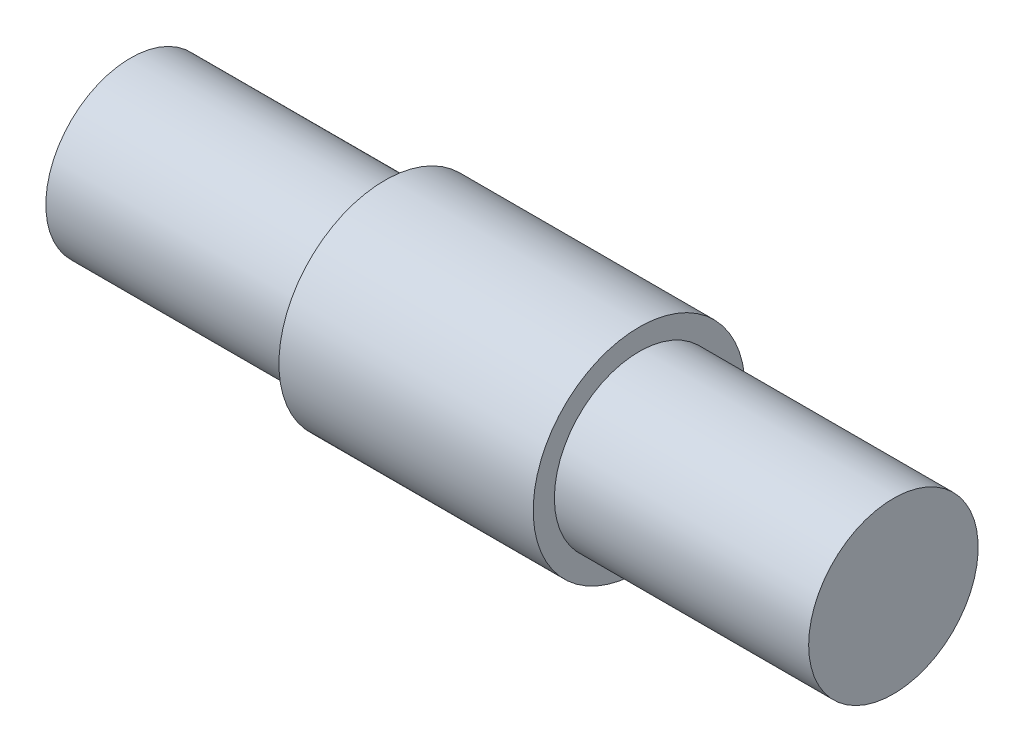
ISO-10303-21;
HEADER;
FILE_DESCRIPTION(('STEP AP214'),'2;1');
FILE_NAME('part.step','',(''),(''),'','','');
FILE_SCHEMA(('AUTOMOTIVE_DESIGN { 1 0 10303 214 1 1 1 1 }'));
ENDSEC;
DATA;
#1=APPLICATION_CONTEXT('core data for automotive mechanical design processes');
#2=APPLICATION_PROTOCOL_DEFINITION('international standard','automotive_design',2000,#1);
#3=PRODUCT_CONTEXT('',#1,'mechanical');
#4=PRODUCT('Part','Part','',(#3));
#5=PRODUCT_RELATED_PRODUCT_CATEGORY('part','',(#4));
#6=PRODUCT_DEFINITION_FORMATION('','',#4);
#7=PRODUCT_DEFINITION_CONTEXT('part definition',#1,'design');
#8=PRODUCT_DEFINITION('design','',#6,#7);
#9=PRODUCT_DEFINITION_SHAPE('','',#8);
#10=(LENGTH_UNIT() NAMED_UNIT(*) SI_UNIT(.MILLI.,.METRE.));
#11=(NAMED_UNIT(*) PLANE_ANGLE_UNIT() SI_UNIT($,.RADIAN.));
#12=(NAMED_UNIT(*) SI_UNIT($,.STERADIAN.) SOLID_ANGLE_UNIT());
#13=UNCERTAINTY_MEASURE_WITH_UNIT(LENGTH_MEASURE(1.E-05),#10,'distance_accuracy_value','');
#14=(GEOMETRIC_REPRESENTATION_CONTEXT(3) GLOBAL_UNCERTAINTY_ASSIGNED_CONTEXT((#13)) GLOBAL_UNIT_ASSIGNED_CONTEXT((#10,
#11,#12)) REPRESENTATION_CONTEXT('',''));
#15=CARTESIAN_POINT('',(0.,0.,0.));
#16=DIRECTION('',(0.,0.,1.));
#17=DIRECTION('',(1.,0.,0.));
#18=AXIS2_PLACEMENT_3D('',#15,#16,#17);
#19=CARTESIAN_POINT('',(4.7625,0.,0.));
#20=DIRECTION('',(-1.,0.,0.));
#21=DIRECTION('',(0.,0.,1.));
#22=AXIS2_PLACEMENT_3D('',#19,#20,#21);
#23=CYLINDRICAL_SURFACE('',#22,3.175);
#24=CARTESIAN_POINT('',(4.7625,0.,0.));
#25=DIRECTION('',(1.,0.,0.));
#26=DIRECTION('',(0.,0.,-1.));
#27=AXIS2_PLACEMENT_3D('',#24,#25,#26);
#28=CIRCLE('',#27,3.175);
#29=CARTESIAN_POINT('',(4.7625,0.,3.175));
#30=VERTEX_POINT('',#29);
#31=EDGE_CURVE('E45',#30,#30,#28,.T.);
#32=CARTESIAN_POINT('',(-4.7625,0.,0.));
#33=DIRECTION('',(1.,0.,0.));
#34=DIRECTION('',(0.,0.,-1.));
#35=AXIS2_PLACEMENT_3D('',#32,#33,#34);
#36=CIRCLE('',#35,3.175);
#37=CARTESIAN_POINT('',(-4.7625,0.,3.175));
#38=VERTEX_POINT('',#37);
#39=EDGE_CURVE('E40',#38,#38,#36,.T.);
#40=CARTESIAN_POINT('',(4.7625,0.,3.175));
#41=CARTESIAN_POINT('',(4.66328125,0.,3.175));
#42=CARTESIAN_POINT('',(4.5640625,0.,3.175));
#43=CARTESIAN_POINT('',(4.365625,0.,3.175));
#44=CARTESIAN_POINT('',(4.26640625,0.,3.175));
#45=CARTESIAN_POINT('',(4.06796875,0.,3.175));
#46=CARTESIAN_POINT('',(3.96875,0.,3.175));
#47=CARTESIAN_POINT('',(3.7703125,0.,3.175));
#48=CARTESIAN_POINT('',(3.67109375,0.,3.175));
#49=CARTESIAN_POINT('',(3.47265625,0.,3.175));
#50=CARTESIAN_POINT('',(3.3734375,0.,3.175));
#51=CARTESIAN_POINT('',(3.175,0.,3.175));
#52=CARTESIAN_POINT('',(3.07578125,0.,3.175));
#53=CARTESIAN_POINT('',(2.87734375,0.,3.175));
#54=CARTESIAN_POINT('',(2.778125,0.,3.175));
#55=CARTESIAN_POINT('',(2.5796875,0.,3.175));
#56=CARTESIAN_POINT('',(2.48046875,0.,3.175));
#57=CARTESIAN_POINT('',(2.28203125,0.,3.175));
#58=CARTESIAN_POINT('',(2.1828125,0.,3.175));
#59=CARTESIAN_POINT('',(1.984375,0.,3.175));
#60=CARTESIAN_POINT('',(1.88515625,0.,3.175));
#61=CARTESIAN_POINT('',(1.68671875,0.,3.175));
#62=CARTESIAN_POINT('',(1.5875,0.,3.175));
#63=CARTESIAN_POINT('',(1.3890625,0.,3.175));
#64=CARTESIAN_POINT('',(1.28984375,0.,3.175));
#65=CARTESIAN_POINT('',(1.09140625,0.,3.175));
#66=CARTESIAN_POINT('',(0.992187499999999,0.,3.175));
#67=CARTESIAN_POINT('',(0.79375,0.,3.175));
#68=CARTESIAN_POINT('',(0.69453125,0.,3.175));
#69=CARTESIAN_POINT('',(0.49609375,0.,3.175));
#70=CARTESIAN_POINT('',(0.396875,0.,3.175));
#71=CARTESIAN_POINT('',(0.1984375,0.,3.175));
#72=CARTESIAN_POINT('',(0.0992187500000001,0.,3.175));
#73=CARTESIAN_POINT('',(-0.0992187500000001,0.,3.175));
#74=CARTESIAN_POINT('',(-0.1984375,0.,3.175));
#75=CARTESIAN_POINT('',(-0.396875,0.,3.175));
#76=CARTESIAN_POINT('',(-0.49609375,0.,3.175));
#77=CARTESIAN_POINT('',(-0.69453125,0.,3.175));
#78=CARTESIAN_POINT('',(-0.793750000000001,0.,3.175));
#79=CARTESIAN_POINT('',(-0.992187500000001,0.,3.175));
#80=CARTESIAN_POINT('',(-1.09140625,0.,3.175));
#81=CARTESIAN_POINT('',(-1.28984375,0.,3.175));
#82=CARTESIAN_POINT('',(-1.3890625,0.,3.175));
#83=CARTESIAN_POINT('',(-1.5875,0.,3.175));
#84=CARTESIAN_POINT('',(-1.68671875,0.,3.175));
#85=CARTESIAN_POINT('',(-1.88515625,0.,3.175));
#86=CARTESIAN_POINT('',(-1.984375,0.,3.175));
#87=CARTESIAN_POINT('',(-2.1828125,0.,3.175));
#88=CARTESIAN_POINT('',(-2.28203125,0.,3.175));
#89=CARTESIAN_POINT('',(-2.48046875,0.,3.175));
#90=CARTESIAN_POINT('',(-2.5796875,0.,3.175));
#91=CARTESIAN_POINT('',(-2.778125,0.,3.175));
#92=CARTESIAN_POINT('',(-2.87734375,0.,3.175));
#93=CARTESIAN_POINT('',(-3.07578125,0.,3.175));
#94=CARTESIAN_POINT('',(-3.175,0.,3.175));
#95=CARTESIAN_POINT('',(-3.3734375,0.,3.175));
#96=CARTESIAN_POINT('',(-3.47265625,0.,3.175));
#97=CARTESIAN_POINT('',(-3.67109375,0.,3.175));
#98=CARTESIAN_POINT('',(-3.7703125,0.,3.175));
#99=CARTESIAN_POINT('',(-3.96875,0.,3.175));
#100=CARTESIAN_POINT('',(-4.06796875,0.,3.175));
#101=CARTESIAN_POINT('',(-4.26640625,0.,3.175));
#102=CARTESIAN_POINT('',(-4.365625,0.,3.175));
#103=CARTESIAN_POINT('',(-4.5640625,0.,3.175));
#104=CARTESIAN_POINT('',(-4.66328125,0.,3.175));
#105=CARTESIAN_POINT('',(-4.7625,0.,3.175));
#106=B_SPLINE_CURVE_WITH_KNOTS('',3,(#40,#41,#42,#43,#44,#45,#46,#47,#48,#49,#50,#51,#52,#53,
#54,#55,#56,#57,#58,#59,#60,#61,#62,#63,#64,#65,#66,#67,#68,#69,#70,#71,#72,#73,#74,#75,#76,#77,
#78,#79,#80,#81,#82,#83,#84,#85,#86,#87,#88,#89,#90,#91,#92,#93,#94,#95,#96,#97,#98,#99,#100,
#101,#102,#103,#104,#105),.UNSPECIFIED.,.F.,.F.,(4,2,2,2,2,2,2,2,2,2,2,2,2,2,2,2,2,2,2,2,2,2,2,
2,2,2,2,2,2,2,2,2,4),(0.,0.29765625,0.5953125,0.892968750000001,1.190625,1.48828125,1.7859375,
2.08359375,2.38125,2.67890625,2.9765625,3.27421875,3.571875,3.86953125,4.1671875,4.46484375,
4.7625,5.06015625,5.3578125,5.65546875,5.953125,6.25078125,6.5484375,6.84609375,7.14375,
7.44140625,7.7390625,8.03671875,8.334375,8.63203125,8.9296875,9.22734375,9.525),.UNSPECIFIED.);
#107=EDGE_CURVE('BSEAM37',#30,#38,#106,.T.);
#108=ORIENTED_EDGE('',*,*,#31,.F.);
#109=ORIENTED_EDGE('',*,*,#39,.T.);
#110=ORIENTED_EDGE('',*,*,#107,.T.);
#111=ORIENTED_EDGE('',*,*,#107,.F.);
#112=EDGE_LOOP('',(#108,#110,#109,#111));
#113=FACE_BOUND('',#112,.T.);
#114=ADVANCED_FACE('F37',(#113),#23,.T.);
#115=CARTESIAN_POINT('',(4.7625,0.,0.));
#116=DIRECTION('',(1.,0.,0.));
#117=DIRECTION('',(0.,0.,-1.));
#118=AXIS2_PLACEMENT_3D('',#115,#116,#117);
#119=PLANE('',#118);
#120=ORIENTED_EDGE('',*,*,#31,.T.);
#121=EDGE_LOOP('',(#120));
#122=FACE_BOUND('',#121,.T.);
#123=ADVANCED_FACE('F83',(#122),#119,.T.);
#124=CARTESIAN_POINT('',(-14.2875,0.,0.));
#125=DIRECTION('',(1.,0.,0.));
#126=DIRECTION('',(0.,0.,-1.));
#127=AXIS2_PLACEMENT_3D('',#124,#125,#126);
#128=CYLINDRICAL_SURFACE('',#127,3.96875);
#129=CARTESIAN_POINT('',(-14.2875,0.,0.));
#130=DIRECTION('',(-1.,0.,0.));
#131=DIRECTION('',(0.,0.,1.));
#132=AXIS2_PLACEMENT_3D('',#129,#130,#131);
#133=CIRCLE('',#132,3.96875);
#134=CARTESIAN_POINT('',(-14.2875,0.,-3.96875));
#135=VERTEX_POINT('',#134);
#136=EDGE_CURVE('E54',#135,#135,#133,.T.);
#137=CARTESIAN_POINT('',(-4.7625,0.,0.));
#138=DIRECTION('',(-1.,0.,0.));
#139=DIRECTION('',(0.,0.,1.));
#140=AXIS2_PLACEMENT_3D('',#137,#138,#139);
#141=CIRCLE('',#140,3.96875);
#142=CARTESIAN_POINT('',(-4.7625,0.,-3.96875));
#143=VERTEX_POINT('',#142);
#144=EDGE_CURVE('E58',#143,#143,#141,.T.);
#145=CARTESIAN_POINT('',(-14.2875,0.,-3.96875));
#146=CARTESIAN_POINT('',(-14.18828125,0.,-3.96875));
#147=CARTESIAN_POINT('',(-14.0890625,0.,-3.96875));
#148=CARTESIAN_POINT('',(-13.890625,0.,-3.96875));
#149=CARTESIAN_POINT('',(-13.79140625,0.,-3.96875));
#150=CARTESIAN_POINT('',(-13.59296875,0.,-3.96875));
#151=CARTESIAN_POINT('',(-13.49375,0.,-3.96875));
#152=CARTESIAN_POINT('',(-13.2953125,0.,-3.96875));
#153=CARTESIAN_POINT('',(-13.19609375,0.,-3.96875));
#154=CARTESIAN_POINT('',(-12.99765625,0.,-3.96875));
#155=CARTESIAN_POINT('',(-12.8984375,0.,-3.96875));
#156=CARTESIAN_POINT('',(-12.7,0.,-3.96875));
#157=CARTESIAN_POINT('',(-12.60078125,0.,-3.96875));
#158=CARTESIAN_POINT('',(-12.40234375,0.,-3.96875));
#159=CARTESIAN_POINT('',(-12.303125,0.,-3.96875));
#160=CARTESIAN_POINT('',(-12.1046875,0.,-3.96875));
#161=CARTESIAN_POINT('',(-12.00546875,0.,-3.96875));
#162=CARTESIAN_POINT('',(-11.80703125,0.,-3.96875));
#163=CARTESIAN_POINT('',(-11.7078125,0.,-3.96875));
#164=CARTESIAN_POINT('',(-11.509375,0.,-3.96875));
#165=CARTESIAN_POINT('',(-11.41015625,0.,-3.96875));
#166=CARTESIAN_POINT('',(-11.21171875,0.,-3.96875));
#167=CARTESIAN_POINT('',(-11.1125,0.,-3.96875));
#168=CARTESIAN_POINT('',(-10.9140625,0.,-3.96875));
#169=CARTESIAN_POINT('',(-10.81484375,0.,-3.96875));
#170=CARTESIAN_POINT('',(-10.61640625,0.,-3.96875));
#171=CARTESIAN_POINT('',(-10.5171875,0.,-3.96875));
#172=CARTESIAN_POINT('',(-10.31875,0.,-3.96875));
#173=CARTESIAN_POINT('',(-10.21953125,0.,-3.96875));
#174=CARTESIAN_POINT('',(-10.02109375,0.,-3.96875));
#175=CARTESIAN_POINT('',(-9.921875,0.,-3.96875));
#176=CARTESIAN_POINT('',(-9.7234375,0.,-3.96875));
#177=CARTESIAN_POINT('',(-9.62421875,0.,-3.96875));
#178=CARTESIAN_POINT('',(-9.42578125,0.,-3.96875));
#179=CARTESIAN_POINT('',(-9.3265625,0.,-3.96875));
#180=CARTESIAN_POINT('',(-9.128125,0.,-3.96875));
#181=CARTESIAN_POINT('',(-9.02890625,0.,-3.96875));
#182=CARTESIAN_POINT('',(-8.83046875,0.,-3.96875));
#183=CARTESIAN_POINT('',(-8.73125,0.,-3.96875));
#184=CARTESIAN_POINT('',(-8.5328125,0.,-3.96875));
#185=CARTESIAN_POINT('',(-8.43359375,0.,-3.96875));
#186=CARTESIAN_POINT('',(-8.23515625,0.,-3.96875));
#187=CARTESIAN_POINT('',(-8.1359375,0.,-3.96875));
#188=CARTESIAN_POINT('',(-7.9375,0.,-3.96875));
#189=CARTESIAN_POINT('',(-7.83828125,0.,-3.96875));
#190=CARTESIAN_POINT('',(-7.63984375,0.,-3.96875));
#191=CARTESIAN_POINT('',(-7.540625,0.,-3.96875));
#192=CARTESIAN_POINT('',(-7.3421875,0.,-3.96875));
#193=CARTESIAN_POINT('',(-7.24296875,0.,-3.96875));
#194=CARTESIAN_POINT('',(-7.04453125,0.,-3.96875));
#195=CARTESIAN_POINT('',(-6.9453125,0.,-3.96875));
#196=CARTESIAN_POINT('',(-6.746875,0.,-3.96875));
#197=CARTESIAN_POINT('',(-6.64765625,0.,-3.96875));
#198=CARTESIAN_POINT('',(-6.44921875,0.,-3.96875));
#199=CARTESIAN_POINT('',(-6.35,0.,-3.96875));
#200=CARTESIAN_POINT('',(-6.1515625,0.,-3.96875));
#201=CARTESIAN_POINT('',(-6.05234375,0.,-3.96875));
#202=CARTESIAN_POINT('',(-5.85390625,0.,-3.96875));
#203=CARTESIAN_POINT('',(-5.7546875,0.,-3.96875));
#204=CARTESIAN_POINT('',(-5.55625,0.,-3.96875));
#205=CARTESIAN_POINT('',(-5.45703125,0.,-3.96875));
#206=CARTESIAN_POINT('',(-5.25859375,0.,-3.96875));
#207=CARTESIAN_POINT('',(-5.159375,0.,-3.96875));
#208=CARTESIAN_POINT('',(-4.9609375,0.,-3.96875));
#209=CARTESIAN_POINT('',(-4.86171875,0.,-3.96875));
#210=CARTESIAN_POINT('',(-4.7625,0.,-3.96875));
#211=B_SPLINE_CURVE_WITH_KNOTS('',3,(#145,#146,#147,#148,#149,#150,#151,#152,#153,#154,#155,
#156,#157,#158,#159,#160,#161,#162,#163,#164,#165,#166,#167,#168,#169,#170,#171,#172,#173,#174,
#175,#176,#177,#178,#179,#180,#181,#182,#183,#184,#185,#186,#187,#188,#189,#190,#191,#192,#193,
#194,#195,#196,#197,#198,#199,#200,#201,#202,#203,#204,#205,#206,#207,#208,#209,#210),
.UNSPECIFIED.,.F.,.F.,(4,2,2,2,2,2,2,2,2,2,2,2,2,2,2,2,2,2,2,2,2,2,2,2,2,2,2,2,2,2,2,2,4),(0.,
0.297656249999998,0.595312499999999,0.892968749999999,1.190625,1.48828125,1.7859375,2.08359375,
2.38125,2.67890625,2.9765625,3.27421875,3.571875,3.86953125,4.1671875,4.46484375,4.7625,
5.06015625,5.3578125,5.65546875,5.953125,6.25078125,6.5484375,6.84609375,7.14375,7.44140625,
7.7390625,8.03671875,8.334375,8.63203125,8.9296875,9.22734375,9.525),.UNSPECIFIED.);
#212=EDGE_CURVE('BSEAM88',#135,#143,#211,.T.);
#213=ORIENTED_EDGE('',*,*,#136,.F.);
#214=ORIENTED_EDGE('',*,*,#144,.T.);
#215=ORIENTED_EDGE('',*,*,#212,.T.);
#216=ORIENTED_EDGE('',*,*,#212,.F.);
#217=EDGE_LOOP('',(#213,#215,#214,#216));
#218=FACE_BOUND('',#217,.T.);
#219=ADVANCED_FACE('F88',(#218),#128,.T.);
#220=CARTESIAN_POINT('',(-14.2875,0.,0.));
#221=DIRECTION('',(-1.,0.,0.));
#222=DIRECTION('',(0.,0.,1.));
#223=AXIS2_PLACEMENT_3D('',#220,#221,#222);
#224=PLANE('',#223);
#225=CARTESIAN_POINT('',(-14.2875,0.,0.));
#226=DIRECTION('',(-1.,0.,0.));
#227=DIRECTION('',(0.,0.,1.));
#228=AXIS2_PLACEMENT_3D('',#225,#226,#227);
#229=CIRCLE('',#228,3.175);
#230=CARTESIAN_POINT('',(-14.2875,0.,-3.175));
#231=VERTEX_POINT('',#230);
#232=EDGE_CURVE('E10',#231,#231,#229,.T.);
#233=ORIENTED_EDGE('',*,*,#232,.F.);
#234=EDGE_LOOP('',(#233));
#235=FACE_BOUND('',#234,.T.);
#236=ORIENTED_EDGE('',*,*,#136,.T.);
#237=EDGE_LOOP('',(#236));
#238=FACE_BOUND('',#237,.T.);
#239=ADVANCED_FACE('F78',(#235,#238),#224,.T.);
#240=CARTESIAN_POINT('',(-4.7625,0.,0.));
#241=DIRECTION('',(-1.,0.,0.));
#242=DIRECTION('',(0.,0.,1.));
#243=AXIS2_PLACEMENT_3D('',#240,#241,#242);
#244=PLANE('',#243);
#245=ORIENTED_EDGE('',*,*,#39,.F.);
#246=EDGE_LOOP('',(#245));
#247=FACE_BOUND('',#246,.T.);
#248=ORIENTED_EDGE('',*,*,#144,.F.);
#249=EDGE_LOOP('',(#248));
#250=FACE_BOUND('',#249,.T.);
#251=ADVANCED_FACE('F71',(#247,#250),#244,.F.);
#252=CARTESIAN_POINT('',(-23.8125,0.,0.));
#253=DIRECTION('',(1.,0.,0.));
#254=DIRECTION('',(0.,0.,-1.));
#255=AXIS2_PLACEMENT_3D('',#252,#253,#254);
#256=CYLINDRICAL_SURFACE('',#255,3.175);
#257=CARTESIAN_POINT('',(-23.8125,0.,0.));
#258=DIRECTION('',(-1.,0.,0.));
#259=DIRECTION('',(0.,0.,1.));
#260=AXIS2_PLACEMENT_3D('',#257,#258,#259);
#261=CIRCLE('',#260,3.175);
#262=CARTESIAN_POINT('',(-23.8125,0.,-3.175));
#263=VERTEX_POINT('',#262);
#264=EDGE_CURVE('E53',#263,#263,#261,.T.);
#265=CARTESIAN_POINT('',(-23.8125,0.,-3.175));
#266=CARTESIAN_POINT('',(-23.71328125,0.,-3.175));
#267=CARTESIAN_POINT('',(-23.6140625,0.,-3.175));
#268=CARTESIAN_POINT('',(-23.415625,0.,-3.175));
#269=CARTESIAN_POINT('',(-23.31640625,0.,-3.175));
#270=CARTESIAN_POINT('',(-23.11796875,0.,-3.175));
#271=CARTESIAN_POINT('',(-23.01875,0.,-3.175));
#272=CARTESIAN_POINT('',(-22.8203125,0.,-3.175));
#273=CARTESIAN_POINT('',(-22.72109375,0.,-3.175));
#274=CARTESIAN_POINT('',(-22.52265625,0.,-3.175));
#275=CARTESIAN_POINT('',(-22.4234375,0.,-3.175));
#276=CARTESIAN_POINT('',(-22.225,0.,-3.175));
#277=CARTESIAN_POINT('',(-22.12578125,0.,-3.175));
#278=CARTESIAN_POINT('',(-21.92734375,0.,-3.175));
#279=CARTESIAN_POINT('',(-21.828125,0.,-3.175));
#280=CARTESIAN_POINT('',(-21.6296875,0.,-3.175));
#281=CARTESIAN_POINT('',(-21.53046875,0.,-3.175));
#282=CARTESIAN_POINT('',(-21.33203125,0.,-3.175));
#283=CARTESIAN_POINT('',(-21.2328125,0.,-3.175));
#284=CARTESIAN_POINT('',(-21.034375,0.,-3.175));
#285=CARTESIAN_POINT('',(-20.93515625,0.,-3.175));
#286=CARTESIAN_POINT('',(-20.73671875,0.,-3.175));
#287=CARTESIAN_POINT('',(-20.6375,0.,-3.175));
#288=CARTESIAN_POINT('',(-20.4390625,0.,-3.175));
#289=CARTESIAN_POINT('',(-20.33984375,0.,-3.175));
#290=CARTESIAN_POINT('',(-20.14140625,0.,-3.175));
#291=CARTESIAN_POINT('',(-20.0421875,0.,-3.175));
#292=CARTESIAN_POINT('',(-19.84375,0.,-3.175));
#293=CARTESIAN_POINT('',(-19.74453125,0.,-3.175));
#294=CARTESIAN_POINT('',(-19.54609375,0.,-3.175));
#295=CARTESIAN_POINT('',(-19.446875,0.,-3.175));
#296=CARTESIAN_POINT('',(-19.2484375,0.,-3.175));
#297=CARTESIAN_POINT('',(-19.14921875,0.,-3.175));
#298=CARTESIAN_POINT('',(-18.95078125,0.,-3.175));
#299=CARTESIAN_POINT('',(-18.8515625,0.,-3.175));
#300=CARTESIAN_POINT('',(-18.653125,0.,-3.175));
#301=CARTESIAN_POINT('',(-18.55390625,0.,-3.175));
#302=CARTESIAN_POINT('',(-18.35546875,0.,-3.175));
#303=CARTESIAN_POINT('',(-18.25625,0.,-3.175));
#304=CARTESIAN_POINT('',(-18.0578125,0.,-3.175));
#305=CARTESIAN_POINT('',(-17.95859375,0.,-3.175));
#306=CARTESIAN_POINT('',(-17.76015625,0.,-3.175));
#307=CARTESIAN_POINT('',(-17.6609375,0.,-3.175));
#308=CARTESIAN_POINT('',(-17.4625,0.,-3.175));
#309=CARTESIAN_POINT('',(-17.36328125,0.,-3.175));
#310=CARTESIAN_POINT('',(-17.16484375,0.,-3.175));
#311=CARTESIAN_POINT('',(-17.065625,0.,-3.175));
#312=CARTESIAN_POINT('',(-16.8671875,0.,-3.175));
#313=CARTESIAN_POINT('',(-16.76796875,0.,-3.175));
#314=CARTESIAN_POINT('',(-16.56953125,0.,-3.175));
#315=CARTESIAN_POINT('',(-16.4703125,0.,-3.175));
#316=CARTESIAN_POINT('',(-16.271875,0.,-3.175));
#317=CARTESIAN_POINT('',(-16.17265625,0.,-3.175));
#318=CARTESIAN_POINT('',(-15.97421875,0.,-3.175));
#319=CARTESIAN_POINT('',(-15.875,0.,-3.175));
#320=CARTESIAN_POINT('',(-15.6765625,0.,-3.175));
#321=CARTESIAN_POINT('',(-15.57734375,0.,-3.175));
#322=CARTESIAN_POINT('',(-15.37890625,0.,-3.175));
#323=CARTESIAN_POINT('',(-15.2796875,0.,-3.175));
#324=CARTESIAN_POINT('',(-15.08125,0.,-3.175));
#325=CARTESIAN_POINT('',(-14.98203125,0.,-3.175));
#326=CARTESIAN_POINT('',(-14.78359375,0.,-3.175));
#327=CARTESIAN_POINT('',(-14.684375,0.,-3.175));
#328=CARTESIAN_POINT('',(-14.4859375,0.,-3.175));
#329=CARTESIAN_POINT('',(-14.38671875,0.,-3.175));
#330=CARTESIAN_POINT('',(-14.2875,0.,-3.175));
#331=B_SPLINE_CURVE_WITH_KNOTS('',3,(#265,#266,#267,#268,#269,#270,#271,#272,#273,#274,#275,
#276,#277,#278,#279,#280,#281,#282,#283,#284,#285,#286,#287,#288,#289,#290,#291,#292,#293,#294,
#295,#296,#297,#298,#299,#300,#301,#302,#303,#304,#305,#306,#307,#308,#309,#310,#311,#312,#313,
#314,#315,#316,#317,#318,#319,#320,#321,#322,#323,#324,#325,#326,#327,#328,#329,#330),
.UNSPECIFIED.,.F.,.F.,(4,2,2,2,2,2,2,2,2,2,2,2,2,2,2,2,2,2,2,2,2,2,2,2,2,2,2,2,2,2,2,2,4),(0.,
0.29765625,0.5953125,0.892968750000001,1.190625,1.48828125,1.7859375,2.08359375,2.38125,
2.67890625,2.9765625,3.27421875,3.571875,3.86953125,4.1671875,4.46484375,4.7625,5.06015625,
5.3578125,5.65546875,5.953125,6.25078125,6.5484375,6.84609375,7.14375,7.44140625,7.7390625,
8.03671875,8.334375,8.63203125,8.9296875,9.22734375,9.525),.UNSPECIFIED.);
#332=EDGE_CURVE('BSEAM69',#263,#231,#331,.T.);
#333=ORIENTED_EDGE('',*,*,#264,.F.);
#334=ORIENTED_EDGE('',*,*,#232,.T.);
#335=ORIENTED_EDGE('',*,*,#332,.T.);
#336=ORIENTED_EDGE('',*,*,#332,.F.);
#337=EDGE_LOOP('',(#333,#335,#334,#336));
#338=FACE_BOUND('',#337,.T.);
#339=ADVANCED_FACE('F69',(#338),#256,.T.);
#340=CARTESIAN_POINT('',(-23.8125,0.,0.));
#341=DIRECTION('',(-1.,0.,0.));
#342=DIRECTION('',(0.,0.,1.));
#343=AXIS2_PLACEMENT_3D('',#340,#341,#342);
#344=PLANE('',#343);
#345=ORIENTED_EDGE('',*,*,#264,.T.);
#346=EDGE_LOOP('',(#345));
#347=FACE_BOUND('',#346,.T.);
#348=ADVANCED_FACE('F67',(#347),#344,.T.);
#349=CLOSED_SHELL('',(#114,#123,#219,#239,#251,#339,#348));
#350=MANIFOLD_SOLID_BREP('B2',#349);
#351=ADVANCED_BREP_SHAPE_REPRESENTATION('',(#18,#350),#14);
#352=SHAPE_DEFINITION_REPRESENTATION(#9,#351);
ENDSEC;
END-ISO-10303-21;
